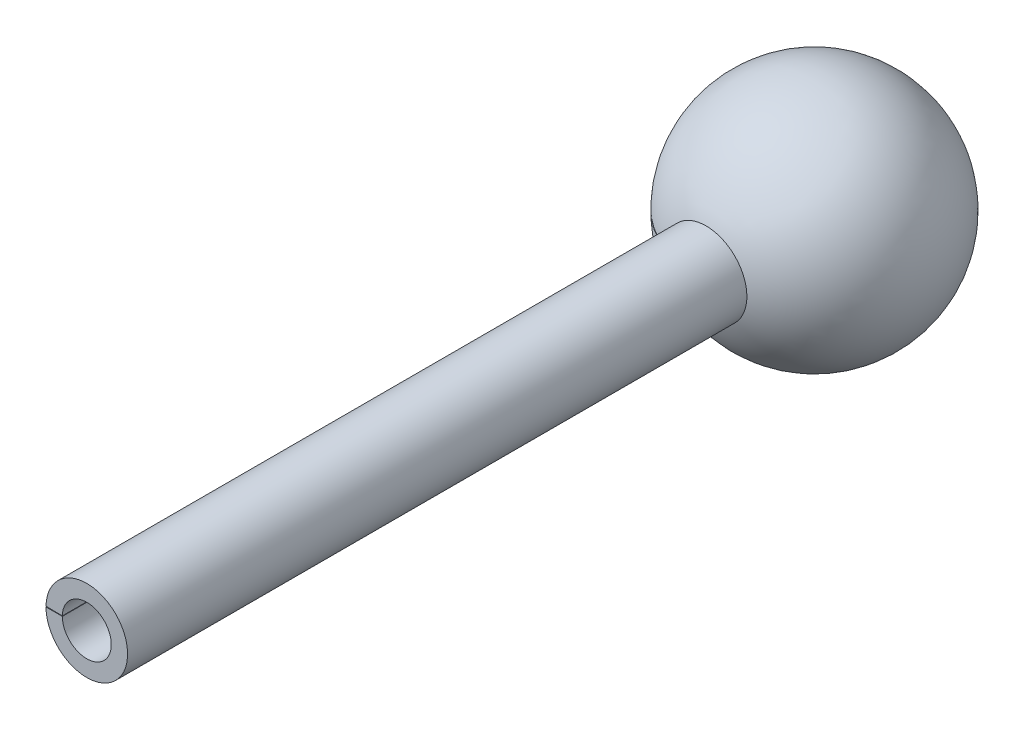
ISO-10303-21;
HEADER;
FILE_DESCRIPTION(('STEP AP214'),'2;1');
FILE_NAME('part.step','',(''),(''),'','','');
FILE_SCHEMA(('AUTOMOTIVE_DESIGN { 1 0 10303 214 1 1 1 1 }'));
ENDSEC;
DATA;
#1=APPLICATION_CONTEXT('core data for automotive mechanical design processes');
#2=APPLICATION_PROTOCOL_DEFINITION('international standard','automotive_design',2000,#1);
#3=PRODUCT_CONTEXT('',#1,'mechanical');
#4=PRODUCT('Part','Part','',(#3));
#5=PRODUCT_RELATED_PRODUCT_CATEGORY('part','',(#4));
#6=PRODUCT_DEFINITION_FORMATION('','',#4);
#7=PRODUCT_DEFINITION_CONTEXT('part definition',#1,'design');
#8=PRODUCT_DEFINITION('design','',#6,#7);
#9=PRODUCT_DEFINITION_SHAPE('','',#8);
#10=(LENGTH_UNIT() NAMED_UNIT(*) SI_UNIT(.MILLI.,.METRE.));
#11=(NAMED_UNIT(*) PLANE_ANGLE_UNIT() SI_UNIT($,.RADIAN.));
#12=(NAMED_UNIT(*) SI_UNIT($,.STERADIAN.) SOLID_ANGLE_UNIT());
#13=UNCERTAINTY_MEASURE_WITH_UNIT(LENGTH_MEASURE(1.E-05),#10,'distance_accuracy_value','');
#14=(GEOMETRIC_REPRESENTATION_CONTEXT(3) GLOBAL_UNCERTAINTY_ASSIGNED_CONTEXT((#13)) GLOBAL_UNIT_ASSIGNED_CONTEXT((#10,
#11,#12)) REPRESENTATION_CONTEXT('',''));
#15=CARTESIAN_POINT('',(0.,0.,0.));
#16=DIRECTION('',(0.,0.,1.));
#17=DIRECTION('',(1.,0.,0.));
#18=AXIS2_PLACEMENT_3D('',#15,#16,#17);
#19=CARTESIAN_POINT('',(0.,0.,0.));
#20=DIRECTION('',(0.,0.,-1.));
#21=DIRECTION('',(0.999847695156391,-0.0174524064372693,0.));
#22=AXIS2_PLACEMENT_3D('',#19,#20,#21);
#23=SPHERICAL_SURFACE('',#22,28.3771370516149);
#24=CARTESIAN_POINT('',(0.,0.,26.5567676355037));
#25=DIRECTION('',(0.,0.,-1.));
#26=DIRECTION('',(-1.,0.,0.));
#27=AXIS2_PLACEMENT_3D('',#24,#25,#26);
#28=CIRCLE('',#27,9.99999999999997);
#29=CARTESIAN_POINT('',(-9.99847695156389,0.174524064372693,26.5567676355037));
#30=VERTEX_POINT('',#29);
#31=CARTESIAN_POINT('',(-9.99999999999997,0.,26.5567676355037));
#32=VERTEX_POINT('',#31);
#33=EDGE_CURVE('E101',#30,#32,#28,.T.);
#34=ORIENTED_EDGE('',*,*,#33,.T.);
#35=CARTESIAN_POINT('',(0.,0.,0.));
#36=DIRECTION('',(0.,1.,0.));
#37=DIRECTION('',(0.,0.,1.));
#38=AXIS2_PLACEMENT_3D('',#35,#36,#37);
#39=CIRCLE('',#38,28.3771370516149);
#40=CARTESIAN_POINT('',(0.,0.,-28.3771370516149));
#41=VERTEX_POINT('',#40);
#42=EDGE_CURVE('E93',#41,#32,#39,.T.);
#43=ORIENTED_EDGE('',*,*,#42,.F.);
#44=CARTESIAN_POINT('',(0.,0.,0.));
#45=DIRECTION('',(0.0174524064372693,0.999847695156391,0.));
#46=DIRECTION('',(0.,0.,1.));
#47=AXIS2_PLACEMENT_3D('',#44,#45,#46);
#48=CIRCLE('',#47,28.3771370516149);
#49=EDGE_CURVE('E103',#41,#30,#48,.T.);
#50=ORIENTED_EDGE('',*,*,#49,.T.);
#51=EDGE_LOOP('',(#34,#43,#50));
#52=FACE_BOUND('',#51,.T.);
#53=ADVANCED_FACE('F35',(#52),#23,.T.);
#54=CARTESIAN_POINT('',(0.,0.,28.3771370516149));
#55=DIRECTION('',(0.,0.,-1.));
#56=DIRECTION('',(-1.,0.,0.));
#57=AXIS2_PLACEMENT_3D('',#54,#55,#56);
#58=CYLINDRICAL_SURFACE('',#57,9.99999999999998);
#59=CARTESIAN_POINT('',(0.,0.,178.377137051615));
#60=DIRECTION('',(0.,0.,-1.));
#61=DIRECTION('',(-1.,0.,0.));
#62=AXIS2_PLACEMENT_3D('',#59,#60,#61);
#63=CIRCLE('',#62,9.99999999999999);
#64=CARTESIAN_POINT('',(-9.99847695156388,0.174524064372693,178.377137051615));
#65=VERTEX_POINT('',#64);
#66=CARTESIAN_POINT('',(-9.99999999999997,0.,178.377137051615));
#67=VERTEX_POINT('',#66);
#68=EDGE_CURVE('E97',#65,#67,#63,.T.);
#69=ORIENTED_EDGE('',*,*,#68,.T.);
#70=DIRECTION('',(0.,0.,-1.));
#71=VECTOR('',#70,1.);
#72=CARTESIAN_POINT('',(-9.99999999999997,0.,0.));
#73=LINE('',#72,#71);
#74=EDGE_CURVE('E116',#67,#32,#73,.T.);
#75=ORIENTED_EDGE('',*,*,#74,.T.);
#76=ORIENTED_EDGE('',*,*,#33,.F.);
#77=DIRECTION('',(0.,0.,-1.));
#78=VECTOR('',#77,1.);
#79=CARTESIAN_POINT('',(-9.99847695156389,0.174524064372693,0.));
#80=LINE('',#79,#78);
#81=EDGE_CURVE('E99',#65,#30,#80,.T.);
#82=ORIENTED_EDGE('',*,*,#81,.F.);
#83=EDGE_LOOP('',(#69,#75,#76,#82));
#84=FACE_BOUND('',#83,.T.);
#85=ADVANCED_FACE('F131',(#84),#58,.T.);
#86=CARTESIAN_POINT('',(0.,0.,178.377137051615));
#87=DIRECTION('',(0.,0.,-1.));
#88=DIRECTION('',(-1.,0.,0.));
#89=AXIS2_PLACEMENT_3D('',#86,#87,#88);
#90=PLANE('',#89);
#91=DIRECTION('',(-0.999847695156391,0.0174524064372693,0.));
#92=VECTOR('',#91,1.);
#93=CARTESIAN_POINT('',(0.,0.,178.377137051615));
#94=LINE('',#93,#92);
#95=CARTESIAN_POINT('',(-5.99908617093833,0.104714438623616,178.377137051615));
#96=VERTEX_POINT('',#95);
#97=EDGE_CURVE('E57',#96,#65,#94,.T.);
#98=ORIENTED_EDGE('',*,*,#97,.F.);
#99=CARTESIAN_POINT('',(0.,0.,178.377137051615));
#100=DIRECTION('',(0.,0.,1.));
#101=DIRECTION('',(1.,0.,0.));
#102=AXIS2_PLACEMENT_3D('',#99,#100,#101);
#103=CIRCLE('',#102,6.);
#104=CARTESIAN_POINT('',(-5.99999999999998,0.,178.377137051615));
#105=VERTEX_POINT('',#104);
#106=EDGE_CURVE('E82',#105,#96,#103,.T.);
#107=ORIENTED_EDGE('',*,*,#106,.F.);
#108=DIRECTION('',(-1.,0.,0.));
#109=VECTOR('',#108,1.);
#110=CARTESIAN_POINT('',(0.,0.,178.377137051615));
#111=LINE('',#110,#109);
#112=EDGE_CURVE('E114',#105,#67,#111,.T.);
#113=ORIENTED_EDGE('',*,*,#112,.T.);
#114=ORIENTED_EDGE('',*,*,#68,.F.);
#115=EDGE_LOOP('',(#98,#107,#113,#114));
#116=FACE_BOUND('',#115,.T.);
#117=ADVANCED_FACE('F95',(#116),#90,.F.);
#118=CARTESIAN_POINT('',(0.,0.,0.));
#119=DIRECTION('',(0.0174524064372693,0.999847695156391,0.));
#120=DIRECTION('',(0.,0.,1.));
#121=AXIS2_PLACEMENT_3D('',#118,#119,#120);
#122=PLANE('',#121);
#123=DIRECTION('',(0.999847695156391,-0.0174524064372693,0.));
#124=VECTOR('',#123,1.);
#125=CARTESIAN_POINT('',(0.,0.,65.3771370516149));
#126=LINE('',#125,#124);
#127=CARTESIAN_POINT('',(-5.99908617093833,0.104714438623616,65.3771370516149));
#128=VERTEX_POINT('',#127);
#129=CARTESIAN_POINT('',(0.,0.,65.3771370516149));
#130=VERTEX_POINT('',#129);
#131=EDGE_CURVE('E49',#128,#130,#126,.T.);
#132=ORIENTED_EDGE('',*,*,#131,.F.);
#133=DIRECTION('',(0.,0.,1.));
#134=VECTOR('',#133,1.);
#135=CARTESIAN_POINT('',(-5.99908617093833,0.104714438623616,65.3771370516149));
#136=LINE('',#135,#134);
#137=EDGE_CURVE('E85',#128,#96,#136,.T.);
#138=ORIENTED_EDGE('',*,*,#137,.T.);
#139=ORIENTED_EDGE('',*,*,#97,.T.);
#140=ORIENTED_EDGE('',*,*,#81,.T.);
#141=ORIENTED_EDGE('',*,*,#49,.F.);
#142=DIRECTION('',(0.,0.,1.));
#143=VECTOR('',#142,1.);
#144=CARTESIAN_POINT('',(0.,0.,0.));
#145=LINE('',#144,#143);
#146=EDGE_CURVE('E111',#41,#130,#145,.T.);
#147=ORIENTED_EDGE('',*,*,#146,.T.);
#148=EDGE_LOOP('',(#132,#138,#139,#140,#141,#147));
#149=FACE_BOUND('',#148,.T.);
#150=ADVANCED_FACE('F91',(#149),#122,.F.);
#151=CARTESIAN_POINT('',(0.,0.,0.));
#152=DIRECTION('',(0.,1.,0.));
#153=DIRECTION('',(0.,0.,1.));
#154=AXIS2_PLACEMENT_3D('',#151,#152,#153);
#155=PLANE('',#154);
#156=DIRECTION('',(0.,0.,1.));
#157=VECTOR('',#156,1.);
#158=CARTESIAN_POINT('',(-5.99999999999998,0.,65.3771370516149));
#159=LINE('',#158,#157);
#160=CARTESIAN_POINT('',(-5.99999999999998,0.,65.3771370516149));
#161=VERTEX_POINT('',#160);
#162=EDGE_CURVE('E11',#161,#105,#159,.T.);
#163=ORIENTED_EDGE('',*,*,#162,.F.);
#164=DIRECTION('',(1.,0.,0.));
#165=VECTOR('',#164,1.);
#166=CARTESIAN_POINT('',(0.,0.,65.3771370516149));
#167=LINE('',#166,#165);
#168=EDGE_CURVE('E42',#161,#130,#167,.T.);
#169=ORIENTED_EDGE('',*,*,#168,.T.);
#170=ORIENTED_EDGE('',*,*,#146,.F.);
#171=ORIENTED_EDGE('',*,*,#42,.T.);
#172=ORIENTED_EDGE('',*,*,#74,.F.);
#173=ORIENTED_EDGE('',*,*,#112,.F.);
#174=EDGE_LOOP('',(#163,#169,#170,#171,#172,#173));
#175=FACE_BOUND('',#174,.T.);
#176=ADVANCED_FACE('F109',(#175),#155,.T.);
#177=CARTESIAN_POINT('',(0.,0.,65.3771370516149));
#178=DIRECTION('',(0.,0.,1.));
#179=DIRECTION('',(1.,0.,0.));
#180=AXIS2_PLACEMENT_3D('',#177,#178,#179);
#181=CYLINDRICAL_SURFACE('',#180,6.);
#182=CARTESIAN_POINT('',(0.,0.,65.3771370516149));
#183=DIRECTION('',(0.,0.,1.));
#184=DIRECTION('',(1.,0.,0.));
#185=AXIS2_PLACEMENT_3D('',#182,#183,#184);
#186=CIRCLE('',#185,6.);
#187=EDGE_CURVE('E89',#161,#128,#186,.T.);
#188=ORIENTED_EDGE('',*,*,#187,.F.);
#189=ORIENTED_EDGE('',*,*,#162,.T.);
#190=ORIENTED_EDGE('',*,*,#106,.T.);
#191=ORIENTED_EDGE('',*,*,#137,.F.);
#192=EDGE_LOOP('',(#188,#189,#190,#191));
#193=FACE_BOUND('',#192,.T.);
#194=ADVANCED_FACE('F84',(#193),#181,.F.);
#195=CARTESIAN_POINT('',(0.,0.,65.3771370516149));
#196=DIRECTION('',(0.,0.,1.));
#197=DIRECTION('',(1.,0.,0.));
#198=AXIS2_PLACEMENT_3D('',#195,#196,#197);
#199=PLANE('',#198);
#200=ORIENTED_EDGE('',*,*,#131,.T.);
#201=ORIENTED_EDGE('',*,*,#168,.F.);
#202=ORIENTED_EDGE('',*,*,#187,.T.);
#203=EDGE_LOOP('',(#200,#201,#202));
#204=FACE_BOUND('',#203,.T.);
#205=ADVANCED_FACE('F123',(#204),#199,.T.);
#206=CLOSED_SHELL('',(#53,#85,#117,#150,#176,#194,#205));
#207=MANIFOLD_SOLID_BREP('B2',#206);
#208=ADVANCED_BREP_SHAPE_REPRESENTATION('',(#18,#207),#14);
#209=SHAPE_DEFINITION_REPRESENTATION(#9,#208);
ENDSEC;
END-ISO-10303-21;
